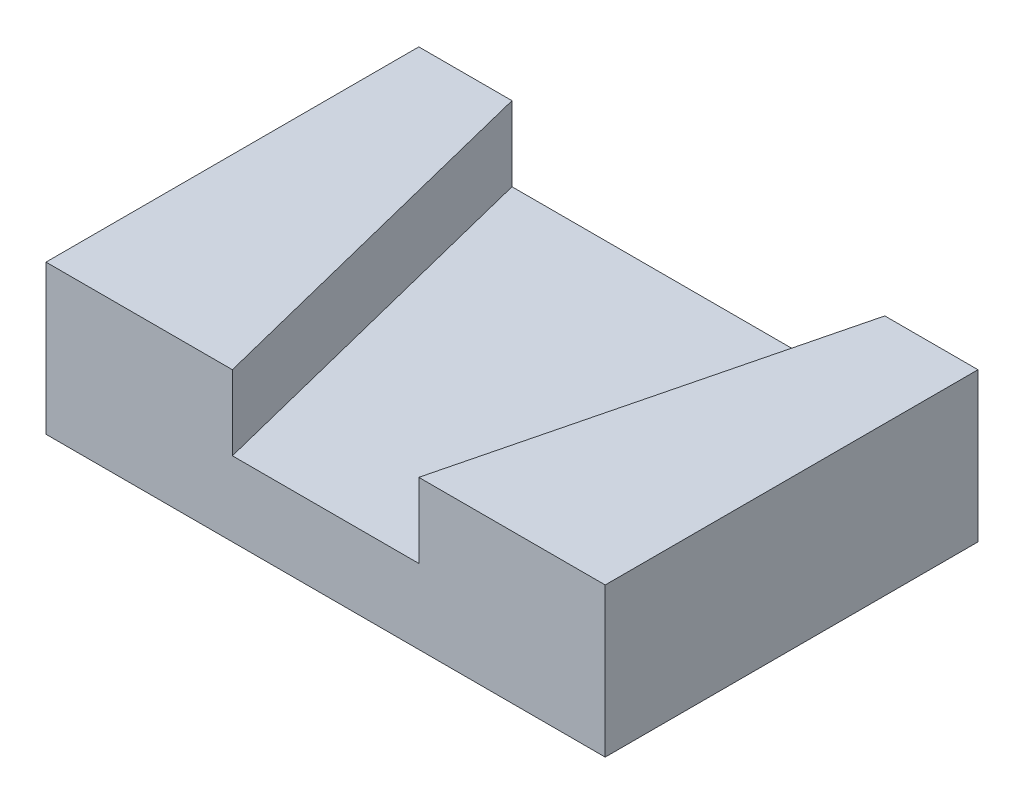
ISO-10303-21;
HEADER;
FILE_DESCRIPTION(('STEP AP214'),'2;1');
FILE_NAME('part.step','',(''),(''),'','','');
FILE_SCHEMA(('AUTOMOTIVE_DESIGN { 1 0 10303 214 1 1 1 1 }'));
ENDSEC;
DATA;
#1=APPLICATION_CONTEXT('core data for automotive mechanical design processes');
#2=APPLICATION_PROTOCOL_DEFINITION('international standard','automotive_design',2000,#1);
#3=PRODUCT_CONTEXT('',#1,'mechanical');
#4=PRODUCT('Part','Part','',(#3));
#5=PRODUCT_RELATED_PRODUCT_CATEGORY('part','',(#4));
#6=PRODUCT_DEFINITION_FORMATION('','',#4);
#7=PRODUCT_DEFINITION_CONTEXT('part definition',#1,'design');
#8=PRODUCT_DEFINITION('design','',#6,#7);
#9=PRODUCT_DEFINITION_SHAPE('','',#8);
#10=(LENGTH_UNIT() NAMED_UNIT(*) SI_UNIT(.MILLI.,.METRE.));
#11=(NAMED_UNIT(*) PLANE_ANGLE_UNIT() SI_UNIT($,.RADIAN.));
#12=(NAMED_UNIT(*) SI_UNIT($,.STERADIAN.) SOLID_ANGLE_UNIT());
#13=UNCERTAINTY_MEASURE_WITH_UNIT(LENGTH_MEASURE(1.E-05),#10,'distance_accuracy_value','');
#14=(GEOMETRIC_REPRESENTATION_CONTEXT(3) GLOBAL_UNCERTAINTY_ASSIGNED_CONTEXT((#13)) GLOBAL_UNIT_ASSIGNED_CONTEXT((#10,
#11,#12)) REPRESENTATION_CONTEXT('',''));
#15=CARTESIAN_POINT('',(0.,0.,0.));
#16=DIRECTION('',(0.,0.,1.));
#17=DIRECTION('',(1.,0.,0.));
#18=AXIS2_PLACEMENT_3D('',#15,#16,#17);
#19=CARTESIAN_POINT('',(0.,40.,0.));
#20=DIRECTION('',(0.,1.,0.));
#21=DIRECTION('',(0.,0.,1.));
#22=AXIS2_PLACEMENT_3D('',#19,#20,#21);
#23=PLANE('',#22);
#24=DIRECTION('',(0.242535625036333,0.,-0.970142500145332));
#25=VECTOR('',#24,1.);
#26=CARTESIAN_POINT('',(25.,40.,50.));
#27=LINE('',#26,#25);
#28=CARTESIAN_POINT('',(25.,40.,50.));
#29=VERTEX_POINT('',#28);
#30=CARTESIAN_POINT('',(50.,40.,-50.));
#31=VERTEX_POINT('',#30);
#32=EDGE_CURVE('E121',#29,#31,#27,.T.);
#33=ORIENTED_EDGE('',*,*,#32,.F.);
#34=DIRECTION('',(1.,0.,0.));
#35=VECTOR('',#34,1.);
#36=CARTESIAN_POINT('',(75.,40.,50.));
#37=LINE('',#36,#35);
#38=CARTESIAN_POINT('',(75.,40.,50.));
#39=VERTEX_POINT('',#38);
#40=EDGE_CURVE('E132',#29,#39,#37,.T.);
#41=ORIENTED_EDGE('',*,*,#40,.T.);
#42=DIRECTION('',(0.,0.,-1.));
#43=VECTOR('',#42,1.);
#44=CARTESIAN_POINT('',(75.,40.,50.));
#45=LINE('',#44,#43);
#46=CARTESIAN_POINT('',(75.,40.,-50.));
#47=VERTEX_POINT('',#46);
#48=EDGE_CURVE('E134',#39,#47,#45,.T.);
#49=ORIENTED_EDGE('',*,*,#48,.T.);
#50=DIRECTION('',(-1.,0.,0.));
#51=VECTOR('',#50,1.);
#52=CARTESIAN_POINT('',(75.,40.,-50.));
#53=LINE('',#52,#51);
#54=EDGE_CURVE('E136',#47,#31,#53,.T.);
#55=ORIENTED_EDGE('',*,*,#54,.T.);
#56=EDGE_LOOP('',(#33,#41,#49,#55));
#57=FACE_BOUND('',#56,.T.);
#58=ADVANCED_FACE('F33',(#57),#23,.T.);
#59=CARTESIAN_POINT('',(-75.,40.,50.));
#60=DIRECTION('',(1.,0.,0.));
#61=DIRECTION('',(0.,0.,-1.));
#62=AXIS2_PLACEMENT_3D('',#59,#60,#61);
#63=PLANE('',#62);
#64=DIRECTION('',(0.,0.,1.));
#65=VECTOR('',#64,1.);
#66=CARTESIAN_POINT('',(-75.,0.,50.));
#67=LINE('',#66,#65);
#68=CARTESIAN_POINT('',(-75.,0.,-50.));
#69=VERTEX_POINT('',#68);
#70=CARTESIAN_POINT('',(-75.,0.,50.));
#71=VERTEX_POINT('',#70);
#72=EDGE_CURVE('E140',#69,#71,#67,.T.);
#73=ORIENTED_EDGE('',*,*,#72,.T.);
#74=DIRECTION('',(0.,-1.,0.));
#75=VECTOR('',#74,1.);
#76=CARTESIAN_POINT('',(-75.,40.,50.));
#77=LINE('',#76,#75);
#78=CARTESIAN_POINT('',(-75.,40.,50.));
#79=VERTEX_POINT('',#78);
#80=EDGE_CURVE('E11',#79,#71,#77,.T.);
#81=ORIENTED_EDGE('',*,*,#80,.F.);
#82=DIRECTION('',(0.,0.,1.));
#83=VECTOR('',#82,1.);
#84=CARTESIAN_POINT('',(-75.,40.,50.));
#85=LINE('',#84,#83);
#86=CARTESIAN_POINT('',(-75.,40.,-50.));
#87=VERTEX_POINT('',#86);
#88=EDGE_CURVE('E130',#87,#79,#85,.T.);
#89=ORIENTED_EDGE('',*,*,#88,.F.);
#90=DIRECTION('',(0.,-1.,0.));
#91=VECTOR('',#90,1.);
#92=CARTESIAN_POINT('',(-75.,40.,-50.));
#93=LINE('',#92,#91);
#94=EDGE_CURVE('E139',#87,#69,#93,.T.);
#95=ORIENTED_EDGE('',*,*,#94,.T.);
#96=EDGE_LOOP('',(#73,#81,#89,#95));
#97=FACE_BOUND('',#96,.T.);
#98=ADVANCED_FACE('F35',(#97),#63,.F.);
#99=CARTESIAN_POINT('',(75.,40.,50.));
#100=DIRECTION('',(0.,0.,-1.));
#101=DIRECTION('',(-1.,0.,0.));
#102=AXIS2_PLACEMENT_3D('',#99,#100,#101);
#103=PLANE('',#102);
#104=ORIENTED_EDGE('',*,*,#40,.F.);
#105=DIRECTION('',(0.,1.,0.));
#106=VECTOR('',#105,1.);
#107=CARTESIAN_POINT('',(25.,20.,50.));
#108=LINE('',#107,#106);
#109=CARTESIAN_POINT('',(25.,20.,50.));
#110=VERTEX_POINT('',#109);
#111=EDGE_CURVE('E125',#110,#29,#108,.T.);
#112=ORIENTED_EDGE('',*,*,#111,.F.);
#113=DIRECTION('',(1.,0.,0.));
#114=VECTOR('',#113,1.);
#115=CARTESIAN_POINT('',(-25.,20.,50.));
#116=LINE('',#115,#114);
#117=CARTESIAN_POINT('',(-25.,20.,50.));
#118=VERTEX_POINT('',#117);
#119=EDGE_CURVE('E112',#118,#110,#116,.T.);
#120=ORIENTED_EDGE('',*,*,#119,.F.);
#121=DIRECTION('',(0.,1.,0.));
#122=VECTOR('',#121,1.);
#123=CARTESIAN_POINT('',(-25.,20.,50.));
#124=LINE('',#123,#122);
#125=CARTESIAN_POINT('',(-25.,40.,50.));
#126=VERTEX_POINT('',#125);
#127=EDGE_CURVE('E109',#118,#126,#124,.T.);
#128=ORIENTED_EDGE('',*,*,#127,.T.);
#129=EDGE_CURVE('E85',#79,#126,#37,.T.);
#130=ORIENTED_EDGE('',*,*,#129,.F.);
#131=ORIENTED_EDGE('',*,*,#80,.T.);
#132=DIRECTION('',(1.,0.,0.));
#133=VECTOR('',#132,1.);
#134=CARTESIAN_POINT('',(75.,0.,50.));
#135=LINE('',#134,#133);
#136=CARTESIAN_POINT('',(75.,0.,50.));
#137=VERTEX_POINT('',#136);
#138=EDGE_CURVE('E143',#71,#137,#135,.T.);
#139=ORIENTED_EDGE('',*,*,#138,.T.);
#140=DIRECTION('',(0.,-1.,0.));
#141=VECTOR('',#140,1.);
#142=CARTESIAN_POINT('',(75.,40.,50.));
#143=LINE('',#142,#141);
#144=EDGE_CURVE('E41',#39,#137,#143,.T.);
#145=ORIENTED_EDGE('',*,*,#144,.F.);
#146=EDGE_LOOP('',(#104,#112,#120,#128,#130,#131,#139,#145));
#147=FACE_BOUND('',#146,.T.);
#148=ADVANCED_FACE('F177',(#147),#103,.F.);
#149=CARTESIAN_POINT('',(75.,40.,50.));
#150=DIRECTION('',(-1.,0.,0.));
#151=DIRECTION('',(0.,0.,1.));
#152=AXIS2_PLACEMENT_3D('',#149,#150,#151);
#153=PLANE('',#152);
#154=DIRECTION('',(0.,0.,-1.));
#155=VECTOR('',#154,1.);
#156=CARTESIAN_POINT('',(75.,0.,50.));
#157=LINE('',#156,#155);
#158=CARTESIAN_POINT('',(75.,0.,-50.));
#159=VERTEX_POINT('',#158);
#160=EDGE_CURVE('E146',#137,#159,#157,.T.);
#161=ORIENTED_EDGE('',*,*,#160,.T.);
#162=DIRECTION('',(0.,-1.,0.));
#163=VECTOR('',#162,1.);
#164=CARTESIAN_POINT('',(75.,40.,-50.));
#165=LINE('',#164,#163);
#166=EDGE_CURVE('E150',#47,#159,#165,.T.);
#167=ORIENTED_EDGE('',*,*,#166,.F.);
#168=ORIENTED_EDGE('',*,*,#48,.F.);
#169=ORIENTED_EDGE('',*,*,#144,.T.);
#170=EDGE_LOOP('',(#161,#167,#168,#169));
#171=FACE_BOUND('',#170,.T.);
#172=ADVANCED_FACE('F156',(#171),#153,.F.);
#173=CARTESIAN_POINT('',(75.,40.,-50.));
#174=DIRECTION('',(0.,0.,1.));
#175=DIRECTION('',(1.,0.,0.));
#176=AXIS2_PLACEMENT_3D('',#173,#174,#175);
#177=PLANE('',#176);
#178=DIRECTION('',(-1.,0.,0.));
#179=VECTOR('',#178,1.);
#180=CARTESIAN_POINT('',(50.,20.,-50.));
#181=LINE('',#180,#179);
#182=CARTESIAN_POINT('',(50.,20.,-50.));
#183=VERTEX_POINT('',#182);
#184=CARTESIAN_POINT('',(-50.,20.,-50.));
#185=VERTEX_POINT('',#184);
#186=EDGE_CURVE('E113',#183,#185,#181,.T.);
#187=ORIENTED_EDGE('',*,*,#186,.F.);
#188=DIRECTION('',(0.,1.,0.));
#189=VECTOR('',#188,1.);
#190=CARTESIAN_POINT('',(50.,20.,-50.));
#191=LINE('',#190,#189);
#192=EDGE_CURVE('E144',#183,#31,#191,.T.);
#193=ORIENTED_EDGE('',*,*,#192,.T.);
#194=ORIENTED_EDGE('',*,*,#54,.F.);
#195=ORIENTED_EDGE('',*,*,#166,.T.);
#196=DIRECTION('',(-1.,0.,0.));
#197=VECTOR('',#196,1.);
#198=CARTESIAN_POINT('',(75.,0.,-50.));
#199=LINE('',#198,#197);
#200=EDGE_CURVE('E78',#159,#69,#199,.T.);
#201=ORIENTED_EDGE('',*,*,#200,.T.);
#202=ORIENTED_EDGE('',*,*,#94,.F.);
#203=CARTESIAN_POINT('',(-50.,40.,-50.));
#204=VERTEX_POINT('',#203);
#205=EDGE_CURVE('E56',#204,#87,#53,.T.);
#206=ORIENTED_EDGE('',*,*,#205,.F.);
#207=DIRECTION('',(0.,1.,0.));
#208=VECTOR('',#207,1.);
#209=CARTESIAN_POINT('',(-50.,20.,-50.));
#210=LINE('',#209,#208);
#211=EDGE_CURVE('E48',#185,#204,#210,.T.);
#212=ORIENTED_EDGE('',*,*,#211,.F.);
#213=EDGE_LOOP('',(#187,#193,#194,#195,#201,#202,#206,#212));
#214=FACE_BOUND('',#213,.T.);
#215=ADVANCED_FACE('F123',(#214),#177,.F.);
#216=DIRECTION('',(0.242535625036333,0.,0.970142500145332));
#217=VECTOR('',#216,1.);
#218=CARTESIAN_POINT('',(-50.,40.,-50.));
#219=LINE('',#218,#217);
#220=EDGE_CURVE('E166',#204,#126,#219,.T.);
#221=ORIENTED_EDGE('',*,*,#220,.F.);
#222=ORIENTED_EDGE('',*,*,#205,.T.);
#223=ORIENTED_EDGE('',*,*,#88,.T.);
#224=ORIENTED_EDGE('',*,*,#129,.T.);
#225=EDGE_LOOP('',(#221,#222,#223,#224));
#226=FACE_BOUND('',#225,.T.);
#227=ADVANCED_FACE('F165',(#226),#23,.T.);
#228=CARTESIAN_POINT('',(0.,0.,0.));
#229=DIRECTION('',(0.,1.,0.));
#230=DIRECTION('',(0.,0.,1.));
#231=AXIS2_PLACEMENT_3D('',#228,#229,#230);
#232=PLANE('',#231);
#233=ORIENTED_EDGE('',*,*,#72,.F.);
#234=ORIENTED_EDGE('',*,*,#200,.F.);
#235=ORIENTED_EDGE('',*,*,#160,.F.);
#236=ORIENTED_EDGE('',*,*,#138,.F.);
#237=EDGE_LOOP('',(#233,#234,#235,#236));
#238=FACE_BOUND('',#237,.T.);
#239=ADVANCED_FACE('F161',(#238),#232,.F.);
#240=CARTESIAN_POINT('',(25.,20.,50.));
#241=DIRECTION('',(0.970142500145332,0.,0.242535625036333));
#242=DIRECTION('',(0.242535625036333,0.,-0.970142500145332));
#243=AXIS2_PLACEMENT_3D('',#240,#241,#242);
#244=PLANE('',#243);
#245=ORIENTED_EDGE('',*,*,#32,.T.);
#246=ORIENTED_EDGE('',*,*,#192,.F.);
#247=DIRECTION('',(0.242535625036333,0.,-0.970142500145332));
#248=VECTOR('',#247,1.);
#249=CARTESIAN_POINT('',(25.,20.,50.));
#250=LINE('',#249,#248);
#251=EDGE_CURVE('E119',#110,#183,#250,.T.);
#252=ORIENTED_EDGE('',*,*,#251,.F.);
#253=ORIENTED_EDGE('',*,*,#111,.T.);
#254=EDGE_LOOP('',(#245,#246,#252,#253));
#255=FACE_BOUND('',#254,.T.);
#256=ADVANCED_FACE('F174',(#255),#244,.F.);
#257=CARTESIAN_POINT('',(-50.,20.,-50.));
#258=DIRECTION('',(-0.970142500145332,0.,0.242535625036333));
#259=DIRECTION('',(0.242535625036333,0.,0.970142500145332));
#260=AXIS2_PLACEMENT_3D('',#257,#258,#259);
#261=PLANE('',#260);
#262=ORIENTED_EDGE('',*,*,#220,.T.);
#263=ORIENTED_EDGE('',*,*,#127,.F.);
#264=DIRECTION('',(0.242535625036333,0.,0.970142500145332));
#265=VECTOR('',#264,1.);
#266=CARTESIAN_POINT('',(-50.,20.,-50.));
#267=LINE('',#266,#265);
#268=EDGE_CURVE('E106',#185,#118,#267,.T.);
#269=ORIENTED_EDGE('',*,*,#268,.F.);
#270=ORIENTED_EDGE('',*,*,#211,.T.);
#271=EDGE_LOOP('',(#262,#263,#269,#270));
#272=FACE_BOUND('',#271,.T.);
#273=ADVANCED_FACE('F108',(#272),#261,.F.);
#274=CARTESIAN_POINT('',(0.,20.,0.));
#275=DIRECTION('',(0.,1.,0.));
#276=DIRECTION('',(0.,0.,1.));
#277=AXIS2_PLACEMENT_3D('',#274,#275,#276);
#278=PLANE('',#277);
#279=ORIENTED_EDGE('',*,*,#186,.T.);
#280=ORIENTED_EDGE('',*,*,#268,.T.);
#281=ORIENTED_EDGE('',*,*,#119,.T.);
#282=ORIENTED_EDGE('',*,*,#251,.T.);
#283=EDGE_LOOP('',(#279,#280,#281,#282));
#284=FACE_BOUND('',#283,.T.);
#285=ADVANCED_FACE('F117',(#284),#278,.T.);
#286=CLOSED_SHELL('',(#58,#98,#148,#172,#215,#227,#239,#256,#273,#285));
#287=MANIFOLD_SOLID_BREP('B2',#286);
#288=ADVANCED_BREP_SHAPE_REPRESENTATION('',(#18,#287),#14);
#289=SHAPE_DEFINITION_REPRESENTATION(#9,#288);
ENDSEC;
END-ISO-10303-21;
